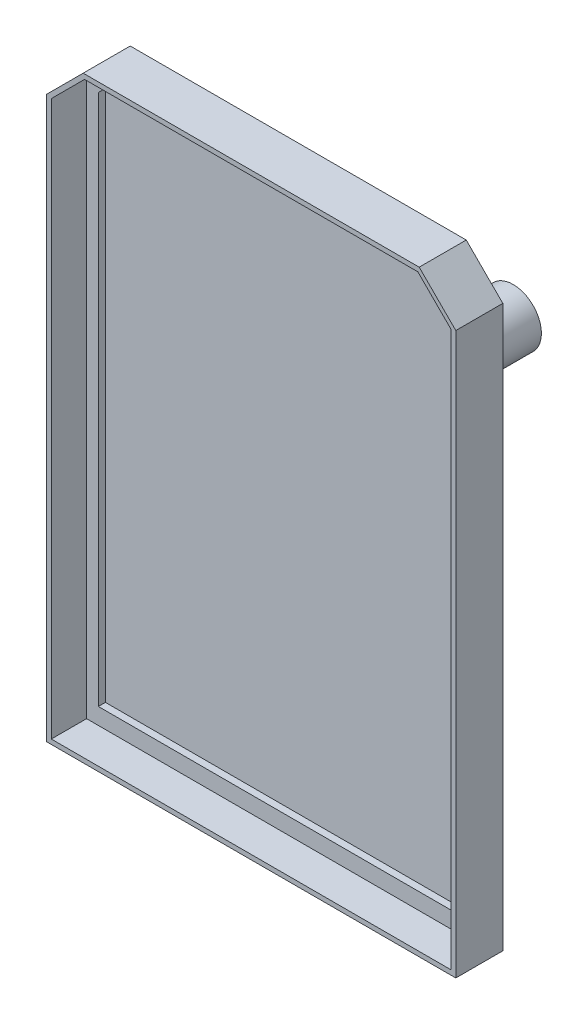
ISO-10303-21;
HEADER;
FILE_DESCRIPTION(('STEP AP214'),'2;1');
FILE_NAME('part.step','',(''),(''),'','','');
FILE_SCHEMA(('AUTOMOTIVE_DESIGN { 1 0 10303 214 1 1 1 1 }'));
ENDSEC;
DATA;
#1=APPLICATION_CONTEXT('core data for automotive mechanical design processes');
#2=APPLICATION_PROTOCOL_DEFINITION('international standard','automotive_design',2000,#1);
#3=PRODUCT_CONTEXT('',#1,'mechanical');
#4=PRODUCT('Part','Part','',(#3));
#5=PRODUCT_RELATED_PRODUCT_CATEGORY('part','',(#4));
#6=PRODUCT_DEFINITION_FORMATION('','',#4);
#7=PRODUCT_DEFINITION_CONTEXT('part definition',#1,'design');
#8=PRODUCT_DEFINITION('design','',#6,#7);
#9=PRODUCT_DEFINITION_SHAPE('','',#8);
#10=(LENGTH_UNIT() NAMED_UNIT(*) SI_UNIT(.MILLI.,.METRE.));
#11=(NAMED_UNIT(*) PLANE_ANGLE_UNIT() SI_UNIT($,.RADIAN.));
#12=(NAMED_UNIT(*) SI_UNIT($,.STERADIAN.) SOLID_ANGLE_UNIT());
#13=UNCERTAINTY_MEASURE_WITH_UNIT(LENGTH_MEASURE(1.E-05),#10,'distance_accuracy_value','');
#14=(GEOMETRIC_REPRESENTATION_CONTEXT(3) GLOBAL_UNCERTAINTY_ASSIGNED_CONTEXT((#13)) GLOBAL_UNIT_ASSIGNED_CONTEXT((#10,
#11,#12)) REPRESENTATION_CONTEXT('',''));
#15=CARTESIAN_POINT('',(0.,0.,0.));
#16=DIRECTION('',(0.,0.,1.));
#17=DIRECTION('',(1.,0.,0.));
#18=AXIS2_PLACEMENT_3D('',#15,#16,#17);
#19=CARTESIAN_POINT('',(47.0251262658472,47.0251262658468,1.5));
#20=DIRECTION('',(0.70710678118655,0.707106781186544,0.));
#21=DIRECTION('',(-0.707106781186545,0.707106781186551,0.));
#22=AXIS2_PLACEMENT_3D('',#19,#20,#21);
#23=PLANE('',#22);
#24=DIRECTION('',(0.707106781186545,-0.707106781186551,0.));
#25=VECTOR('',#24,1.);
#26=CARTESIAN_POINT('',(47.0251262658472,47.0251262658468,0.));
#27=LINE('',#26,#25);
#28=CARTESIAN_POINT('',(35.0502525316942,59.,0.));
#29=VERTEX_POINT('',#28);
#30=CARTESIAN_POINT('',(40.,54.0502525316941,0.));
#31=VERTEX_POINT('',#30);
#32=EDGE_CURVE('E171',#29,#31,#27,.T.);
#33=ORIENTED_EDGE('',*,*,#32,.T.);
#34=DIRECTION('',(0.,0.,-1.));
#35=VECTOR('',#34,1.);
#36=CARTESIAN_POINT('',(40.,54.0502525316941,1.5));
#37=LINE('',#36,#35);
#38=CARTESIAN_POINT('',(40.,54.0502525316941,1.5));
#39=VERTEX_POINT('',#38);
#40=EDGE_CURVE('E318',#39,#31,#37,.T.);
#41=ORIENTED_EDGE('',*,*,#40,.F.);
#42=DIRECTION('',(0.707106781186545,-0.707106781186551,0.));
#43=VECTOR('',#42,1.);
#44=CARTESIAN_POINT('',(47.0251262658472,47.0251262658468,1.5));
#45=LINE('',#44,#43);
#46=CARTESIAN_POINT('',(35.0502525316942,59.,1.5));
#47=VERTEX_POINT('',#46);
#48=EDGE_CURVE('E259',#47,#39,#45,.T.);
#49=ORIENTED_EDGE('',*,*,#48,.F.);
#50=DIRECTION('',(0.,0.,-1.));
#51=VECTOR('',#50,1.);
#52=CARTESIAN_POINT('',(35.0502525316942,59.,1.5));
#53=LINE('',#52,#51);
#54=EDGE_CURVE('E288',#47,#29,#53,.T.);
#55=ORIENTED_EDGE('',*,*,#54,.T.);
#56=EDGE_LOOP('',(#33,#41,#49,#55));
#57=FACE_BOUND('',#56,.T.);
#58=ADVANCED_FACE('F41',(#57),#23,.F.);
#59=CARTESIAN_POINT('',(40.,0.,1.5));
#60=DIRECTION('',(1.,0.,0.));
#61=DIRECTION('',(0.,0.,-1.));
#62=AXIS2_PLACEMENT_3D('',#59,#60,#61);
#63=PLANE('',#62);
#64=DIRECTION('',(0.,-1.,0.));
#65=VECTOR('',#64,1.);
#66=CARTESIAN_POINT('',(40.,0.,0.));
#67=LINE('',#66,#65);
#68=CARTESIAN_POINT('',(40.,-59.,0.));
#69=VERTEX_POINT('',#68);
#70=EDGE_CURVE('E291',#31,#69,#67,.T.);
#71=ORIENTED_EDGE('',*,*,#70,.T.);
#72=DIRECTION('',(0.,0.,-1.));
#73=VECTOR('',#72,1.);
#74=CARTESIAN_POINT('',(40.,-59.,1.5));
#75=LINE('',#74,#73);
#76=CARTESIAN_POINT('',(40.,-59.,1.5));
#77=VERTEX_POINT('',#76);
#78=EDGE_CURVE('E315',#77,#69,#75,.T.);
#79=ORIENTED_EDGE('',*,*,#78,.F.);
#80=DIRECTION('',(0.,-1.,0.));
#81=VECTOR('',#80,1.);
#82=CARTESIAN_POINT('',(40.,0.,1.5));
#83=LINE('',#82,#81);
#84=EDGE_CURVE('E262',#39,#77,#83,.T.);
#85=ORIENTED_EDGE('',*,*,#84,.F.);
#86=ORIENTED_EDGE('',*,*,#40,.T.);
#87=EDGE_LOOP('',(#71,#79,#85,#86));
#88=FACE_BOUND('',#87,.T.);
#89=ADVANCED_FACE('F338',(#88),#63,.F.);
#90=CARTESIAN_POINT('',(0.,-59.,1.5));
#91=DIRECTION('',(0.,-1.,0.));
#92=DIRECTION('',(0.,0.,-1.));
#93=AXIS2_PLACEMENT_3D('',#90,#91,#92);
#94=PLANE('',#93);
#95=DIRECTION('',(-1.,0.,0.));
#96=VECTOR('',#95,1.);
#97=CARTESIAN_POINT('',(0.,-59.,0.));
#98=LINE('',#97,#96);
#99=CARTESIAN_POINT('',(-40.,-59.,0.));
#100=VERTEX_POINT('',#99);
#101=EDGE_CURVE('E294',#69,#100,#98,.T.);
#102=ORIENTED_EDGE('',*,*,#101,.T.);
#103=DIRECTION('',(0.,0.,-1.));
#104=VECTOR('',#103,1.);
#105=CARTESIAN_POINT('',(-40.,-59.,1.5));
#106=LINE('',#105,#104);
#107=CARTESIAN_POINT('',(-40.,-59.,1.5));
#108=VERTEX_POINT('',#107);
#109=EDGE_CURVE('E312',#108,#100,#106,.T.);
#110=ORIENTED_EDGE('',*,*,#109,.F.);
#111=DIRECTION('',(-1.,0.,0.));
#112=VECTOR('',#111,1.);
#113=CARTESIAN_POINT('',(0.,-59.,1.5));
#114=LINE('',#113,#112);
#115=EDGE_CURVE('E265',#77,#108,#114,.T.);
#116=ORIENTED_EDGE('',*,*,#115,.F.);
#117=ORIENTED_EDGE('',*,*,#78,.T.);
#118=EDGE_LOOP('',(#102,#110,#116,#117));
#119=FACE_BOUND('',#118,.T.);
#120=ADVANCED_FACE('F344',(#119),#94,.F.);
#121=CARTESIAN_POINT('',(-40.,0.,1.5));
#122=DIRECTION('',(-1.,0.,0.));
#123=DIRECTION('',(0.,0.,1.));
#124=AXIS2_PLACEMENT_3D('',#121,#122,#123);
#125=PLANE('',#124);
#126=DIRECTION('',(0.,1.,0.));
#127=VECTOR('',#126,1.);
#128=CARTESIAN_POINT('',(-40.,0.,0.));
#129=LINE('',#128,#127);
#130=CARTESIAN_POINT('',(-40.,54.0502525316942,0.));
#131=VERTEX_POINT('',#130);
#132=EDGE_CURVE('E297',#100,#131,#129,.T.);
#133=ORIENTED_EDGE('',*,*,#132,.T.);
#134=DIRECTION('',(0.,0.,-1.));
#135=VECTOR('',#134,1.);
#136=CARTESIAN_POINT('',(-40.,54.0502525316942,1.5));
#137=LINE('',#136,#135);
#138=CARTESIAN_POINT('',(-40.,54.0502525316942,1.5));
#139=VERTEX_POINT('',#138);
#140=EDGE_CURVE('E309',#139,#131,#137,.T.);
#141=ORIENTED_EDGE('',*,*,#140,.F.);
#142=DIRECTION('',(0.,1.,0.));
#143=VECTOR('',#142,1.);
#144=CARTESIAN_POINT('',(-40.,0.,1.5));
#145=LINE('',#144,#143);
#146=EDGE_CURVE('E267',#108,#139,#145,.T.);
#147=ORIENTED_EDGE('',*,*,#146,.F.);
#148=ORIENTED_EDGE('',*,*,#109,.T.);
#149=EDGE_LOOP('',(#133,#141,#147,#148));
#150=FACE_BOUND('',#149,.T.);
#151=ADVANCED_FACE('F350',(#150),#125,.F.);
#152=CARTESIAN_POINT('',(-47.025126265847,47.0251262658472,1.5));
#153=DIRECTION('',(-0.707106781186545,0.707106781186549,0.));
#154=DIRECTION('',(-0.70710678118655,-0.707106781186546,0.));
#155=AXIS2_PLACEMENT_3D('',#152,#153,#154);
#156=PLANE('',#155);
#157=DIRECTION('',(0.70710678118655,0.707106781186546,0.));
#158=VECTOR('',#157,1.);
#159=CARTESIAN_POINT('',(-47.025126265847,47.0251262658472,0.));
#160=LINE('',#159,#158);
#161=CARTESIAN_POINT('',(-35.0502525316941,59.,0.));
#162=VERTEX_POINT('',#161);
#163=EDGE_CURVE('E300',#131,#162,#160,.T.);
#164=ORIENTED_EDGE('',*,*,#163,.T.);
#165=DIRECTION('',(0.,0.,-1.));
#166=VECTOR('',#165,1.);
#167=CARTESIAN_POINT('',(-35.0502525316941,59.,1.5));
#168=LINE('',#167,#166);
#169=CARTESIAN_POINT('',(-35.0502525316941,59.,1.5));
#170=VERTEX_POINT('',#169);
#171=EDGE_CURVE('E306',#170,#162,#168,.T.);
#172=ORIENTED_EDGE('',*,*,#171,.F.);
#173=DIRECTION('',(0.70710678118655,0.707106781186546,0.));
#174=VECTOR('',#173,1.);
#175=CARTESIAN_POINT('',(-47.025126265847,47.0251262658472,1.5));
#176=LINE('',#175,#174);
#177=EDGE_CURVE('E269',#139,#170,#176,.T.);
#178=ORIENTED_EDGE('',*,*,#177,.F.);
#179=ORIENTED_EDGE('',*,*,#140,.T.);
#180=EDGE_LOOP('',(#164,#172,#178,#179));
#181=FACE_BOUND('',#180,.T.);
#182=ADVANCED_FACE('F354',(#181),#156,.F.);
#183=CARTESIAN_POINT('',(0.,59.,1.5));
#184=DIRECTION('',(0.,-1.,0.));
#185=DIRECTION('',(1.,0.,0.));
#186=AXIS2_PLACEMENT_3D('',#183,#184,#185);
#187=PLANE('',#186);
#188=DIRECTION('',(-1.,0.,0.));
#189=VECTOR('',#188,1.);
#190=CARTESIAN_POINT('',(0.,59.,0.));
#191=LINE('',#190,#189);
#192=EDGE_CURVE('E263',#29,#162,#191,.T.);
#193=ORIENTED_EDGE('',*,*,#192,.F.);
#194=ORIENTED_EDGE('',*,*,#54,.F.);
#195=DIRECTION('',(-1.,0.,0.));
#196=VECTOR('',#195,1.);
#197=CARTESIAN_POINT('',(0.,59.,1.5));
#198=LINE('',#197,#196);
#199=EDGE_CURVE('E271',#47,#170,#198,.T.);
#200=ORIENTED_EDGE('',*,*,#199,.T.);
#201=ORIENTED_EDGE('',*,*,#171,.T.);
#202=EDGE_LOOP('',(#193,#194,#200,#201));
#203=FACE_BOUND('',#202,.T.);
#204=ADVANCED_FACE('F358',(#203),#187,.T.);
#205=CARTESIAN_POINT('',(0.,0.,1.5));
#206=DIRECTION('',(0.,0.,1.));
#207=DIRECTION('',(1.,0.,0.));
#208=AXIS2_PLACEMENT_3D('',#205,#206,#207);
#209=PLANE('',#208);
#210=ORIENTED_EDGE('',*,*,#48,.T.);
#211=ORIENTED_EDGE('',*,*,#84,.T.);
#212=ORIENTED_EDGE('',*,*,#115,.T.);
#213=ORIENTED_EDGE('',*,*,#146,.T.);
#214=ORIENTED_EDGE('',*,*,#177,.T.);
#215=ORIENTED_EDGE('',*,*,#199,.F.);
#216=EDGE_LOOP('',(#210,#211,#212,#213,#214,#215));
#217=FACE_BOUND('',#216,.T.);
#218=DIRECTION('',(0.707106781186548,0.707106781186547,0.));
#219=VECTOR('',#218,1.);
#220=CARTESIAN_POINT('',(-48.9644660940672,48.9644660940673,1.5));
#221=LINE('',#220,#219);
#222=CARTESIAN_POINT('',(-42.5,55.4289321881345,1.5));
#223=VERTEX_POINT('',#222);
#224=CARTESIAN_POINT('',(-35.4289321881345,62.5,1.5));
#225=VERTEX_POINT('',#224);
#226=EDGE_CURVE('E274',#223,#225,#221,.T.);
#227=ORIENTED_EDGE('',*,*,#226,.F.);
#228=DIRECTION('',(0.,-1.,0.));
#229=VECTOR('',#228,1.);
#230=CARTESIAN_POINT('',(-42.5,0.,1.5));
#231=LINE('',#230,#229);
#232=CARTESIAN_POINT('',(-42.5,-62.5,1.5));
#233=VERTEX_POINT('',#232);
#234=EDGE_CURVE('E276',#223,#233,#231,.T.);
#235=ORIENTED_EDGE('',*,*,#234,.T.);
#236=DIRECTION('',(-1.,0.,0.));
#237=VECTOR('',#236,1.);
#238=CARTESIAN_POINT('',(0.,-62.5,1.5));
#239=LINE('',#238,#237);
#240=CARTESIAN_POINT('',(42.5,-62.5,1.5));
#241=VERTEX_POINT('',#240);
#242=EDGE_CURVE('E278',#241,#233,#239,.T.);
#243=ORIENTED_EDGE('',*,*,#242,.F.);
#244=DIRECTION('',(0.,-1.,0.));
#245=VECTOR('',#244,1.);
#246=CARTESIAN_POINT('',(42.5,0.,1.5));
#247=LINE('',#246,#245);
#248=CARTESIAN_POINT('',(42.5,55.4289321881345,1.5));
#249=VERTEX_POINT('',#248);
#250=EDGE_CURVE('E281',#249,#241,#247,.T.);
#251=ORIENTED_EDGE('',*,*,#250,.F.);
#252=DIRECTION('',(0.707106781186546,-0.70710678118655,0.));
#253=VECTOR('',#252,1.);
#254=CARTESIAN_POINT('',(48.9644660940674,48.9644660940671,1.5));
#255=LINE('',#254,#253);
#256=CARTESIAN_POINT('',(35.4289321881346,62.5,1.5));
#257=VERTEX_POINT('',#256);
#258=EDGE_CURVE('E284',#257,#249,#255,.T.);
#259=ORIENTED_EDGE('',*,*,#258,.F.);
#260=DIRECTION('',(-1.,0.,0.));
#261=VECTOR('',#260,1.);
#262=CARTESIAN_POINT('',(0.,62.5,1.5));
#263=LINE('',#262,#261);
#264=EDGE_CURVE('E57',#257,#225,#263,.T.);
#265=ORIENTED_EDGE('',*,*,#264,.T.);
#266=EDGE_LOOP('',(#227,#235,#243,#251,#259,#265));
#267=FACE_BOUND('',#266,.T.);
#268=ADVANCED_FACE('F362',(#217,#267),#209,.T.);
#269=CARTESIAN_POINT('',(0.,-63.5,9.));
#270=DIRECTION('',(0.,1.,0.));
#271=DIRECTION('',(0.,0.,1.));
#272=AXIS2_PLACEMENT_3D('',#269,#270,#271);
#273=PLANE('',#272);
#274=DIRECTION('',(0.,0.,-1.));
#275=VECTOR('',#274,1.);
#276=CARTESIAN_POINT('',(-43.5,-63.5,9.));
#277=LINE('',#276,#275);
#278=CARTESIAN_POINT('',(-43.5,-63.5,9.));
#279=VERTEX_POINT('',#278);
#280=CARTESIAN_POINT('',(-43.5,-63.5,-1.));
#281=VERTEX_POINT('',#280);
#282=EDGE_CURVE('E187',#279,#281,#277,.T.);
#283=ORIENTED_EDGE('',*,*,#282,.T.);
#284=DIRECTION('',(1.,0.,0.));
#285=VECTOR('',#284,1.);
#286=CARTESIAN_POINT('',(0.,-63.5,-1.));
#287=LINE('',#286,#285);
#288=CARTESIAN_POINT('',(43.5,-63.5,-1.));
#289=VERTEX_POINT('',#288);
#290=EDGE_CURVE('E179',#281,#289,#287,.T.);
#291=ORIENTED_EDGE('',*,*,#290,.T.);
#292=DIRECTION('',(0.,0.,-1.));
#293=VECTOR('',#292,1.);
#294=CARTESIAN_POINT('',(43.5,-63.5,9.));
#295=LINE('',#294,#293);
#296=CARTESIAN_POINT('',(43.5,-63.5,9.));
#297=VERTEX_POINT('',#296);
#298=EDGE_CURVE('E161',#297,#289,#295,.T.);
#299=ORIENTED_EDGE('',*,*,#298,.F.);
#300=DIRECTION('',(1.,0.,0.));
#301=VECTOR('',#300,1.);
#302=CARTESIAN_POINT('',(0.,-63.5,9.));
#303=LINE('',#302,#301);
#304=EDGE_CURVE('E222',#279,#297,#303,.T.);
#305=ORIENTED_EDGE('',*,*,#304,.F.);
#306=EDGE_LOOP('',(#283,#291,#299,#305));
#307=FACE_BOUND('',#306,.T.);
#308=ADVANCED_FACE('F185',(#307),#273,.F.);
#309=CARTESIAN_POINT('',(43.5,0.,9.));
#310=DIRECTION('',(-1.,0.,0.));
#311=DIRECTION('',(0.,0.,1.));
#312=AXIS2_PLACEMENT_3D('',#309,#310,#311);
#313=PLANE('',#312);
#314=ORIENTED_EDGE('',*,*,#298,.T.);
#315=DIRECTION('',(0.,1.,0.));
#316=VECTOR('',#315,1.);
#317=CARTESIAN_POINT('',(43.5,0.,-1.));
#318=LINE('',#317,#316);
#319=CARTESIAN_POINT('',(43.5,55.721825406948,-1.));
#320=VERTEX_POINT('',#319);
#321=EDGE_CURVE('E165',#289,#320,#318,.T.);
#322=ORIENTED_EDGE('',*,*,#321,.T.);
#323=DIRECTION('',(0.,0.,-1.));
#324=VECTOR('',#323,1.);
#325=CARTESIAN_POINT('',(43.5,55.721825406948,9.));
#326=LINE('',#325,#324);
#327=CARTESIAN_POINT('',(43.5,55.721825406948,9.));
#328=VERTEX_POINT('',#327);
#329=EDGE_CURVE('E172',#328,#320,#326,.T.);
#330=ORIENTED_EDGE('',*,*,#329,.F.);
#331=DIRECTION('',(0.,1.,0.));
#332=VECTOR('',#331,1.);
#333=CARTESIAN_POINT('',(43.5,0.,9.));
#334=LINE('',#333,#332);
#335=EDGE_CURVE('E166',#297,#328,#334,.T.);
#336=ORIENTED_EDGE('',*,*,#335,.F.);
#337=EDGE_LOOP('',(#314,#322,#330,#336));
#338=FACE_BOUND('',#337,.T.);
#339=ADVANCED_FACE('F163',(#338),#313,.F.);
#340=CARTESIAN_POINT('',(49.610912703474,49.610912703474,9.));
#341=DIRECTION('',(-0.707106781186547,-0.707106781186547,0.));
#342=DIRECTION('',(0.707106781186548,-0.707106781186548,0.));
#343=AXIS2_PLACEMENT_3D('',#340,#341,#342);
#344=PLANE('',#343);
#345=ORIENTED_EDGE('',*,*,#329,.T.);
#346=DIRECTION('',(-0.707106781186548,0.707106781186548,0.));
#347=VECTOR('',#346,1.);
#348=CARTESIAN_POINT('',(49.610912703474,49.610912703474,-1.));
#349=LINE('',#348,#347);
#350=CARTESIAN_POINT('',(35.721825406948,63.5,-1.));
#351=VERTEX_POINT('',#350);
#352=EDGE_CURVE('E183',#320,#351,#349,.T.);
#353=ORIENTED_EDGE('',*,*,#352,.T.);
#354=DIRECTION('',(0.,0.,-1.));
#355=VECTOR('',#354,1.);
#356=CARTESIAN_POINT('',(35.721825406948,63.5,9.));
#357=LINE('',#356,#355);
#358=CARTESIAN_POINT('',(35.721825406948,63.5,9.));
#359=VERTEX_POINT('',#358);
#360=EDGE_CURVE('E240',#359,#351,#357,.T.);
#361=ORIENTED_EDGE('',*,*,#360,.F.);
#362=DIRECTION('',(-0.707106781186548,0.707106781186548,0.));
#363=VECTOR('',#362,1.);
#364=CARTESIAN_POINT('',(49.610912703474,49.610912703474,9.));
#365=LINE('',#364,#363);
#366=EDGE_CURVE('E225',#328,#359,#365,.T.);
#367=ORIENTED_EDGE('',*,*,#366,.F.);
#368=EDGE_LOOP('',(#345,#353,#361,#367));
#369=FACE_BOUND('',#368,.T.);
#370=ADVANCED_FACE('F397',(#369),#344,.F.);
#371=CARTESIAN_POINT('',(0.,63.5,9.));
#372=DIRECTION('',(0.,-1.,0.));
#373=DIRECTION('',(0.,0.,-1.));
#374=AXIS2_PLACEMENT_3D('',#371,#372,#373);
#375=PLANE('',#374);
#376=ORIENTED_EDGE('',*,*,#360,.T.);
#377=DIRECTION('',(-1.,0.,0.));
#378=VECTOR('',#377,1.);
#379=CARTESIAN_POINT('',(0.,63.5,-1.));
#380=LINE('',#379,#378);
#381=CARTESIAN_POINT('',(-35.721825406948,63.5,-1.));
#382=VERTEX_POINT('',#381);
#383=EDGE_CURVE('E196',#351,#382,#380,.T.);
#384=ORIENTED_EDGE('',*,*,#383,.T.);
#385=DIRECTION('',(0.,0.,-1.));
#386=VECTOR('',#385,1.);
#387=CARTESIAN_POINT('',(-35.721825406948,63.5,9.));
#388=LINE('',#387,#386);
#389=CARTESIAN_POINT('',(-35.721825406948,63.5,9.));
#390=VERTEX_POINT('',#389);
#391=EDGE_CURVE('E238',#390,#382,#388,.T.);
#392=ORIENTED_EDGE('',*,*,#391,.F.);
#393=DIRECTION('',(-1.,0.,0.));
#394=VECTOR('',#393,1.);
#395=CARTESIAN_POINT('',(0.,63.5,9.));
#396=LINE('',#395,#394);
#397=EDGE_CURVE('E227',#359,#390,#396,.T.);
#398=ORIENTED_EDGE('',*,*,#397,.F.);
#399=EDGE_LOOP('',(#376,#384,#392,#398));
#400=FACE_BOUND('',#399,.T.);
#401=ADVANCED_FACE('F400',(#400),#375,.F.);
#402=CARTESIAN_POINT('',(-49.6109127034739,49.6109127034742,9.));
#403=DIRECTION('',(0.707106781186545,-0.70710678118655,0.));
#404=DIRECTION('',(0.70710678118655,0.707106781186545,0.));
#405=AXIS2_PLACEMENT_3D('',#402,#403,#404);
#406=PLANE('',#405);
#407=ORIENTED_EDGE('',*,*,#391,.T.);
#408=DIRECTION('',(-0.70710678118655,-0.707106781186545,0.));
#409=VECTOR('',#408,1.);
#410=CARTESIAN_POINT('',(-49.6109127034739,49.6109127034742,-1.));
#411=LINE('',#410,#409);
#412=CARTESIAN_POINT('',(-43.5,55.721825406948,-1.));
#413=VERTEX_POINT('',#412);
#414=EDGE_CURVE('E199',#382,#413,#411,.T.);
#415=ORIENTED_EDGE('',*,*,#414,.T.);
#416=DIRECTION('',(0.,0.,-1.));
#417=VECTOR('',#416,1.);
#418=CARTESIAN_POINT('',(-43.5,55.721825406948,9.));
#419=LINE('',#418,#417);
#420=CARTESIAN_POINT('',(-43.5,55.721825406948,9.));
#421=VERTEX_POINT('',#420);
#422=EDGE_CURVE('E235',#421,#413,#419,.T.);
#423=ORIENTED_EDGE('',*,*,#422,.F.);
#424=DIRECTION('',(-0.70710678118655,-0.707106781186545,0.));
#425=VECTOR('',#424,1.);
#426=CARTESIAN_POINT('',(-49.6109127034739,49.6109127034742,9.));
#427=LINE('',#426,#425);
#428=EDGE_CURVE('E229',#390,#421,#427,.T.);
#429=ORIENTED_EDGE('',*,*,#428,.F.);
#430=EDGE_LOOP('',(#407,#415,#423,#429));
#431=FACE_BOUND('',#430,.T.);
#432=ADVANCED_FACE('F371',(#431),#406,.F.);
#433=CARTESIAN_POINT('',(42.5,0.,9.));
#434=DIRECTION('',(-1.,0.,0.));
#435=DIRECTION('',(0.,0.,1.));
#436=AXIS2_PLACEMENT_3D('',#433,#434,#435);
#437=PLANE('',#436);
#438=DIRECTION('',(0.,0.,-1.));
#439=VECTOR('',#438,1.);
#440=CARTESIAN_POINT('',(42.5,55.4289321881345,9.));
#441=LINE('',#440,#439);
#442=CARTESIAN_POINT('',(42.5,55.4289321881345,9.));
#443=VERTEX_POINT('',#442);
#444=EDGE_CURVE('E233',#443,#249,#441,.T.);
#445=ORIENTED_EDGE('',*,*,#444,.T.);
#446=ORIENTED_EDGE('',*,*,#250,.T.);
#447=DIRECTION('',(0.,0.,-1.));
#448=VECTOR('',#447,1.);
#449=CARTESIAN_POINT('',(42.5,-62.5,9.));
#450=LINE('',#449,#448);
#451=CARTESIAN_POINT('',(42.5,-62.5,9.));
#452=VERTEX_POINT('',#451);
#453=EDGE_CURVE('E236',#452,#241,#450,.T.);
#454=ORIENTED_EDGE('',*,*,#453,.F.);
#455=DIRECTION('',(0.,1.,0.));
#456=VECTOR('',#455,1.);
#457=CARTESIAN_POINT('',(42.5,0.,9.));
#458=LINE('',#457,#456);
#459=EDGE_CURVE('E204',#452,#443,#458,.T.);
#460=ORIENTED_EDGE('',*,*,#459,.T.);
#461=EDGE_LOOP('',(#445,#446,#454,#460));
#462=FACE_BOUND('',#461,.T.);
#463=ADVANCED_FACE('F367',(#462),#437,.T.);
#464=CARTESIAN_POINT('',(0.,-62.5,9.));
#465=DIRECTION('',(0.,1.,0.));
#466=DIRECTION('',(0.,0.,1.));
#467=AXIS2_PLACEMENT_3D('',#464,#465,#466);
#468=PLANE('',#467);
#469=ORIENTED_EDGE('',*,*,#453,.T.);
#470=ORIENTED_EDGE('',*,*,#242,.T.);
#471=DIRECTION('',(0.,0.,-1.));
#472=VECTOR('',#471,1.);
#473=CARTESIAN_POINT('',(-42.5,-62.5,9.));
#474=LINE('',#473,#472);
#475=CARTESIAN_POINT('',(-42.5,-62.5,9.));
#476=VERTEX_POINT('',#475);
#477=EDGE_CURVE('E254',#476,#233,#474,.T.);
#478=ORIENTED_EDGE('',*,*,#477,.F.);
#479=DIRECTION('',(1.,0.,0.));
#480=VECTOR('',#479,1.);
#481=CARTESIAN_POINT('',(0.,-62.5,9.));
#482=LINE('',#481,#480);
#483=EDGE_CURVE('E207',#476,#452,#482,.T.);
#484=ORIENTED_EDGE('',*,*,#483,.T.);
#485=EDGE_LOOP('',(#469,#470,#478,#484));
#486=FACE_BOUND('',#485,.T.);
#487=ADVANCED_FACE('F370',(#486),#468,.T.);
#488=CARTESIAN_POINT('',(-42.5,0.,9.));
#489=DIRECTION('',(1.,0.,0.));
#490=DIRECTION('',(0.,0.,-1.));
#491=AXIS2_PLACEMENT_3D('',#488,#489,#490);
#492=PLANE('',#491);
#493=ORIENTED_EDGE('',*,*,#477,.T.);
#494=ORIENTED_EDGE('',*,*,#234,.F.);
#495=DIRECTION('',(0.,0.,-1.));
#496=VECTOR('',#495,1.);
#497=CARTESIAN_POINT('',(-42.5,55.4289321881345,9.));
#498=LINE('',#497,#496);
#499=CARTESIAN_POINT('',(-42.5,55.4289321881345,9.));
#500=VERTEX_POINT('',#499);
#501=EDGE_CURVE('E251',#500,#223,#498,.T.);
#502=ORIENTED_EDGE('',*,*,#501,.F.);
#503=DIRECTION('',(0.,-1.,0.));
#504=VECTOR('',#503,1.);
#505=CARTESIAN_POINT('',(-42.5,0.,9.));
#506=LINE('',#505,#504);
#507=EDGE_CURVE('E210',#500,#476,#506,.T.);
#508=ORIENTED_EDGE('',*,*,#507,.T.);
#509=EDGE_LOOP('',(#493,#494,#502,#508));
#510=FACE_BOUND('',#509,.T.);
#511=ADVANCED_FACE('F375',(#510),#492,.T.);
#512=CARTESIAN_POINT('',(-48.9644660940672,48.9644660940673,9.));
#513=DIRECTION('',(0.707106781186547,-0.707106781186548,0.));
#514=DIRECTION('',(0.707106781186548,0.707106781186547,0.));
#515=AXIS2_PLACEMENT_3D('',#512,#513,#514);
#516=PLANE('',#515);
#517=ORIENTED_EDGE('',*,*,#501,.T.);
#518=ORIENTED_EDGE('',*,*,#226,.T.);
#519=DIRECTION('',(0.,0.,-1.));
#520=VECTOR('',#519,1.);
#521=CARTESIAN_POINT('',(-35.4289321881345,62.5,9.));
#522=LINE('',#521,#520);
#523=CARTESIAN_POINT('',(-35.4289321881345,62.5,9.));
#524=VERTEX_POINT('',#523);
#525=EDGE_CURVE('E248',#524,#225,#522,.T.);
#526=ORIENTED_EDGE('',*,*,#525,.F.);
#527=DIRECTION('',(-0.707106781186548,-0.707106781186547,0.));
#528=VECTOR('',#527,1.);
#529=CARTESIAN_POINT('',(-48.9644660940672,48.9644660940673,9.));
#530=LINE('',#529,#528);
#531=EDGE_CURVE('E213',#524,#500,#530,.T.);
#532=ORIENTED_EDGE('',*,*,#531,.T.);
#533=EDGE_LOOP('',(#517,#518,#526,#532));
#534=FACE_BOUND('',#533,.T.);
#535=ADVANCED_FACE('F379',(#534),#516,.T.);
#536=CARTESIAN_POINT('',(0.,62.5,9.));
#537=DIRECTION('',(0.,-1.,0.));
#538=DIRECTION('',(0.,0.,-1.));
#539=AXIS2_PLACEMENT_3D('',#536,#537,#538);
#540=PLANE('',#539);
#541=ORIENTED_EDGE('',*,*,#525,.T.);
#542=ORIENTED_EDGE('',*,*,#264,.F.);
#543=DIRECTION('',(0.,0.,-1.));
#544=VECTOR('',#543,1.);
#545=CARTESIAN_POINT('',(35.4289321881346,62.5,9.));
#546=LINE('',#545,#544);
#547=CARTESIAN_POINT('',(35.4289321881346,62.5,9.));
#548=VERTEX_POINT('',#547);
#549=EDGE_CURVE('E245',#548,#257,#546,.T.);
#550=ORIENTED_EDGE('',*,*,#549,.F.);
#551=DIRECTION('',(-1.,0.,0.));
#552=VECTOR('',#551,1.);
#553=CARTESIAN_POINT('',(0.,62.5,9.));
#554=LINE('',#553,#552);
#555=EDGE_CURVE('E216',#548,#524,#554,.T.);
#556=ORIENTED_EDGE('',*,*,#555,.T.);
#557=EDGE_LOOP('',(#541,#542,#550,#556));
#558=FACE_BOUND('',#557,.T.);
#559=ADVANCED_FACE('F383',(#558),#540,.T.);
#560=CARTESIAN_POINT('',(48.9644660940674,48.9644660940671,9.));
#561=DIRECTION('',(-0.707106781186549,-0.707106781186545,0.));
#562=DIRECTION('',(0.707106781186546,-0.70710678118655,0.));
#563=AXIS2_PLACEMENT_3D('',#560,#561,#562);
#564=PLANE('',#563);
#565=ORIENTED_EDGE('',*,*,#549,.T.);
#566=ORIENTED_EDGE('',*,*,#258,.T.);
#567=ORIENTED_EDGE('',*,*,#444,.F.);
#568=DIRECTION('',(-0.707106781186546,0.70710678118655,0.));
#569=VECTOR('',#568,1.);
#570=CARTESIAN_POINT('',(48.9644660940674,48.9644660940671,9.));
#571=LINE('',#570,#569);
#572=EDGE_CURVE('E219',#443,#548,#571,.T.);
#573=ORIENTED_EDGE('',*,*,#572,.T.);
#574=EDGE_LOOP('',(#565,#566,#567,#573));
#575=FACE_BOUND('',#574,.T.);
#576=ADVANCED_FACE('F387',(#575),#564,.T.);
#577=CARTESIAN_POINT('',(-43.5,0.,9.));
#578=DIRECTION('',(1.,0.,0.));
#579=DIRECTION('',(0.,0.,-1.));
#580=AXIS2_PLACEMENT_3D('',#577,#578,#579);
#581=PLANE('',#580);
#582=ORIENTED_EDGE('',*,*,#422,.T.);
#583=DIRECTION('',(0.,-1.,0.));
#584=VECTOR('',#583,1.);
#585=CARTESIAN_POINT('',(-43.5,0.,-1.));
#586=LINE('',#585,#584);
#587=EDGE_CURVE('E202',#413,#281,#586,.T.);
#588=ORIENTED_EDGE('',*,*,#587,.T.);
#589=ORIENTED_EDGE('',*,*,#282,.F.);
#590=DIRECTION('',(0.,-1.,0.));
#591=VECTOR('',#590,1.);
#592=CARTESIAN_POINT('',(-43.5,0.,9.));
#593=LINE('',#592,#591);
#594=EDGE_CURVE('E231',#421,#279,#593,.T.);
#595=ORIENTED_EDGE('',*,*,#594,.F.);
#596=EDGE_LOOP('',(#582,#588,#589,#595));
#597=FACE_BOUND('',#596,.T.);
#598=ADVANCED_FACE('F391',(#597),#581,.F.);
#599=CARTESIAN_POINT('',(0.,0.,9.));
#600=DIRECTION('',(0.,0.,1.));
#601=DIRECTION('',(1.,0.,0.));
#602=AXIS2_PLACEMENT_3D('',#599,#600,#601);
#603=PLANE('',#602);
#604=ORIENTED_EDGE('',*,*,#459,.F.);
#605=ORIENTED_EDGE('',*,*,#483,.F.);
#606=ORIENTED_EDGE('',*,*,#507,.F.);
#607=ORIENTED_EDGE('',*,*,#531,.F.);
#608=ORIENTED_EDGE('',*,*,#555,.F.);
#609=ORIENTED_EDGE('',*,*,#572,.F.);
#610=EDGE_LOOP('',(#604,#605,#606,#607,#608,#609));
#611=FACE_BOUND('',#610,.T.);
#612=ORIENTED_EDGE('',*,*,#304,.T.);
#613=ORIENTED_EDGE('',*,*,#335,.T.);
#614=ORIENTED_EDGE('',*,*,#366,.T.);
#615=ORIENTED_EDGE('',*,*,#397,.T.);
#616=ORIENTED_EDGE('',*,*,#428,.T.);
#617=ORIENTED_EDGE('',*,*,#594,.T.);
#618=EDGE_LOOP('',(#612,#613,#614,#615,#616,#617));
#619=FACE_BOUND('',#618,.T.);
#620=ADVANCED_FACE('F410',(#611,#619),#603,.T.);
#621=CARTESIAN_POINT('',(0.,0.,0.));
#622=DIRECTION('',(0.,0.,1.));
#623=DIRECTION('',(1.,0.,0.));
#624=AXIS2_PLACEMENT_3D('',#621,#622,#623);
#625=PLANE('',#624);
#626=ORIENTED_EDGE('',*,*,#32,.F.);
#627=ORIENTED_EDGE('',*,*,#192,.T.);
#628=ORIENTED_EDGE('',*,*,#163,.F.);
#629=ORIENTED_EDGE('',*,*,#132,.F.);
#630=ORIENTED_EDGE('',*,*,#101,.F.);
#631=ORIENTED_EDGE('',*,*,#70,.F.);
#632=EDGE_LOOP('',(#626,#627,#628,#629,#630,#631));
#633=FACE_BOUND('',#632,.T.);
#634=ADVANCED_FACE('F413',(#633),#625,.T.);
#635=CARTESIAN_POINT('',(0.,0.,-1.));
#636=DIRECTION('',(0.,0.,1.));
#637=DIRECTION('',(1.,0.,0.));
#638=AXIS2_PLACEMENT_3D('',#635,#636,#637);
#639=PLANE('',#638);
#640=CARTESIAN_POINT('',(-4.3,4.3,-1.));
#641=DIRECTION('',(0.,0.,1.));
#642=DIRECTION('',(1.,0.,0.));
#643=AXIS2_PLACEMENT_3D('',#640,#641,#642);
#644=CIRCLE('',#643,36.);
#645=CARTESIAN_POINT('',(31.7,4.3,-1.));
#646=VERTEX_POINT('',#645);
#647=EDGE_CURVE('E11',#646,#646,#644,.T.);
#648=ORIENTED_EDGE('',*,*,#647,.T.);
#649=EDGE_LOOP('',(#648));
#650=FACE_BOUND('',#649,.T.);
#651=ORIENTED_EDGE('',*,*,#290,.F.);
#652=ORIENTED_EDGE('',*,*,#587,.F.);
#653=ORIENTED_EDGE('',*,*,#414,.F.);
#654=ORIENTED_EDGE('',*,*,#383,.F.);
#655=ORIENTED_EDGE('',*,*,#352,.F.);
#656=ORIENTED_EDGE('',*,*,#321,.F.);
#657=EDGE_LOOP('',(#651,#652,#653,#654,#655,#656));
#658=FACE_BOUND('',#657,.T.);
#659=ADVANCED_FACE('F177',(#650,#658),#639,.F.);
#660=CARTESIAN_POINT('',(-4.3,4.3,-51.));
#661=DIRECTION('',(0.,0.,-1.));
#662=DIRECTION('',(-1.,0.,0.));
#663=AXIS2_PLACEMENT_3D('',#660,#661,#662);
#664=PLANE('',#663);
#665=CARTESIAN_POINT('',(-4.3,4.3,-51.));
#666=DIRECTION('',(0.,0.,-1.));
#667=DIRECTION('',(-1.,0.,0.));
#668=AXIS2_PLACEMENT_3D('',#665,#666,#667);
#669=CIRCLE('',#668,6.);
#670=CARTESIAN_POINT('',(-10.3,4.3,-51.));
#671=VERTEX_POINT('',#670);
#672=EDGE_CURVE('E188',#671,#671,#669,.T.);
#673=ORIENTED_EDGE('',*,*,#672,.T.);
#674=EDGE_LOOP('',(#673));
#675=FACE_BOUND('',#674,.T.);
#676=CARTESIAN_POINT('',(-4.3,4.3,-51.));
#677=DIRECTION('',(0.,0.,-1.));
#678=DIRECTION('',(-1.,0.,0.));
#679=AXIS2_PLACEMENT_3D('',#676,#677,#678);
#680=CIRCLE('',#679,4.25);
#681=CARTESIAN_POINT('',(-8.55,4.3,-51.));
#682=VERTEX_POINT('',#681);
#683=EDGE_CURVE('E191',#682,#682,#680,.T.);
#684=ORIENTED_EDGE('',*,*,#683,.F.);
#685=EDGE_LOOP('',(#684));
#686=FACE_BOUND('',#685,.T.);
#687=ADVANCED_FACE('F419',(#675,#686),#664,.T.);
#688=CARTESIAN_POINT('',(-4.3,4.3,-51.));
#689=DIRECTION('',(0.,0.,1.));
#690=DIRECTION('',(1.,0.,0.));
#691=AXIS2_PLACEMENT_3D('',#688,#689,#690);
#692=CYLINDRICAL_SURFACE('',#691,6.);
#693=CARTESIAN_POINT('',(-4.3,4.3,-31.));
#694=DIRECTION('',(0.,0.,1.));
#695=DIRECTION('',(1.,0.,0.));
#696=AXIS2_PLACEMENT_3D('',#693,#694,#695);
#697=CIRCLE('',#696,6.);
#698=CARTESIAN_POINT('',(1.7,4.3,-31.));
#699=VERTEX_POINT('',#698);
#700=EDGE_CURVE('E50',#699,#699,#697,.F.);
#701=ORIENTED_EDGE('',*,*,#700,.T.);
#702=EDGE_LOOP('',(#701));
#703=FACE_BOUND('',#702,.T.);
#704=ORIENTED_EDGE('',*,*,#672,.F.);
#705=EDGE_LOOP('',(#704));
#706=FACE_BOUND('',#705,.T.);
#707=ADVANCED_FACE('F323',(#703,#706),#692,.T.);
#708=CARTESIAN_POINT('',(-4.3,4.3,-51.));
#709=DIRECTION('',(0.,0.,1.));
#710=DIRECTION('',(1.,0.,0.));
#711=AXIS2_PLACEMENT_3D('',#708,#709,#710);
#712=CYLINDRICAL_SURFACE('',#711,4.25);
#713=ORIENTED_EDGE('',*,*,#683,.T.);
#714=EDGE_LOOP('',(#713));
#715=FACE_BOUND('',#714,.T.);
#716=CARTESIAN_POINT('',(-4.3,4.3,-1.));
#717=DIRECTION('',(0.,0.,-1.));
#718=DIRECTION('',(-1.,0.,0.));
#719=AXIS2_PLACEMENT_3D('',#716,#717,#718);
#720=CIRCLE('',#719,4.25);
#721=CARTESIAN_POINT('',(-8.55,4.3,-1.));
#722=VERTEX_POINT('',#721);
#723=EDGE_CURVE('E434',#722,#722,#720,.T.);
#724=ORIENTED_EDGE('',*,*,#723,.F.);
#725=EDGE_LOOP('',(#724));
#726=FACE_BOUND('',#725,.T.);
#727=ADVANCED_FACE('F333',(#715,#726),#712,.F.);
#728=ORIENTED_EDGE('',*,*,#723,.T.);
#729=EDGE_LOOP('',(#728));
#730=FACE_BOUND('',#729,.T.);
#731=ADVANCED_FACE('F327',(#730),#639,.F.);
#732=CARTESIAN_POINT('',(-4.3,4.3,-31.));
#733=DIRECTION('',(0.,0.,1.));
#734=DIRECTION('',(1.,0.,0.));
#735=AXIS2_PLACEMENT_3D('',#732,#733,#734);
#736=TOROIDAL_SURFACE('',#735,36.,30.);
#737=ORIENTED_EDGE('',*,*,#647,.F.);
#738=EDGE_LOOP('',(#737));
#739=FACE_BOUND('',#738,.T.);
#740=ORIENTED_EDGE('',*,*,#700,.F.);
#741=EDGE_LOOP('',(#740));
#742=FACE_BOUND('',#741,.T.);
#743=ADVANCED_FACE('F43',(#739,#742),#736,.F.);
#744=CLOSED_SHELL('',(#58,#89,#120,#151,#182,#204,#268,#308,#339,#370,#401,#432,#463,#487,#511,
#535,#559,#576,#598,#620,#634,#659,#687,#707,#727,#731,#743));
#745=MANIFOLD_SOLID_BREP('B2',#744);
#746=ADVANCED_BREP_SHAPE_REPRESENTATION('',(#18,#745),#14);
#747=SHAPE_DEFINITION_REPRESENTATION(#9,#746);
ENDSEC;
END-ISO-10303-21;
